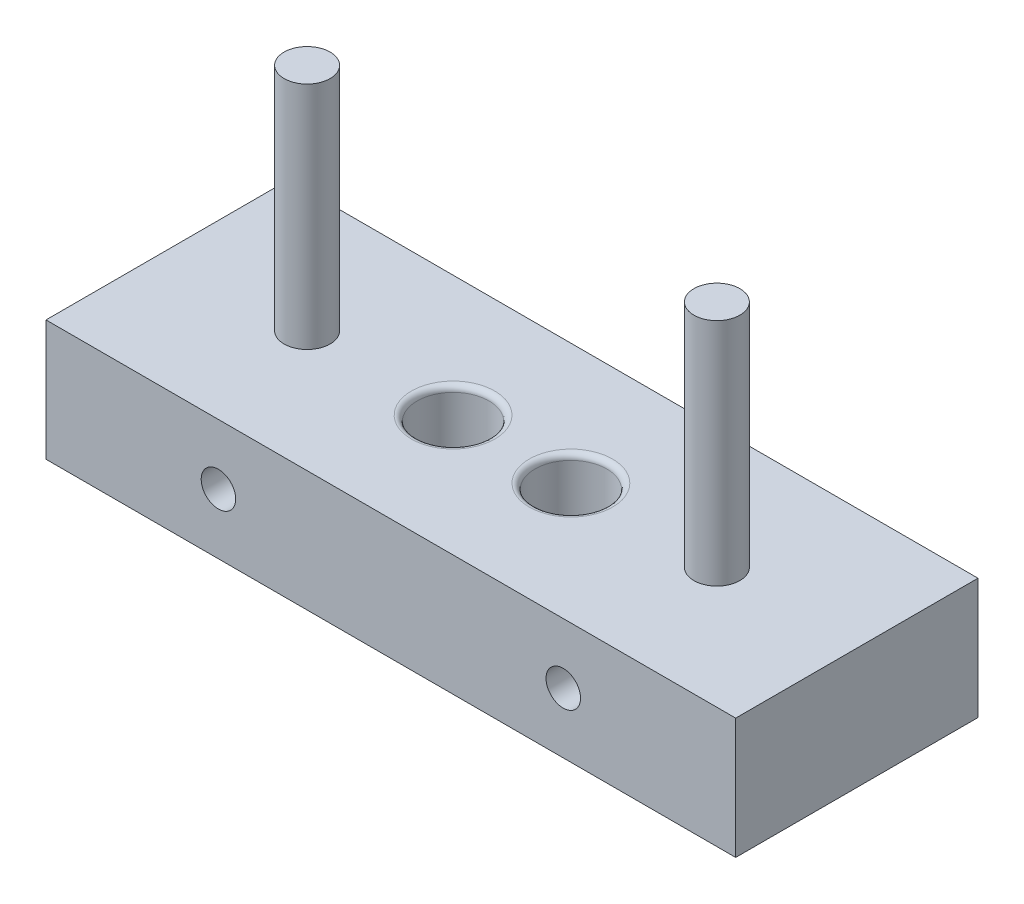
ISO-10303-21;
HEADER;
FILE_DESCRIPTION(('STEP AP214'),'2;1');
FILE_NAME('part.step','',(''),(''),'','','');
FILE_SCHEMA(('AUTOMOTIVE_DESIGN { 1 0 10303 214 1 1 1 1 }'));
ENDSEC;
DATA;
#1=APPLICATION_CONTEXT('core data for automotive mechanical design processes');
#2=APPLICATION_PROTOCOL_DEFINITION('international standard','automotive_design',2000,#1);
#3=PRODUCT_CONTEXT('',#1,'mechanical');
#4=PRODUCT('Part','Part','',(#3));
#5=PRODUCT_RELATED_PRODUCT_CATEGORY('part','',(#4));
#6=PRODUCT_DEFINITION_FORMATION('','',#4);
#7=PRODUCT_DEFINITION_CONTEXT('part definition',#1,'design');
#8=PRODUCT_DEFINITION('design','',#6,#7);
#9=PRODUCT_DEFINITION_SHAPE('','',#8);
#10=(LENGTH_UNIT() NAMED_UNIT(*) SI_UNIT(.MILLI.,.METRE.));
#11=(NAMED_UNIT(*) PLANE_ANGLE_UNIT() SI_UNIT($,.RADIAN.));
#12=(NAMED_UNIT(*) SI_UNIT($,.STERADIAN.) SOLID_ANGLE_UNIT());
#13=UNCERTAINTY_MEASURE_WITH_UNIT(LENGTH_MEASURE(1.E-05),#10,'distance_accuracy_value','');
#14=(GEOMETRIC_REPRESENTATION_CONTEXT(3) GLOBAL_UNCERTAINTY_ASSIGNED_CONTEXT((#13)) GLOBAL_UNIT_ASSIGNED_CONTEXT((#10,
#11,#12)) REPRESENTATION_CONTEXT('',''));
#15=CARTESIAN_POINT('',(0.,0.,0.));
#16=DIRECTION('',(0.,0.,1.));
#17=DIRECTION('',(1.,0.,0.));
#18=AXIS2_PLACEMENT_3D('',#15,#16,#17);
#19=CARTESIAN_POINT('',(-43.188970763014,21.,-20.565514618493));
#20=DIRECTION('',(1.,0.,0.));
#21=DIRECTION('',(0.,0.,-1.));
#22=AXIS2_PLACEMENT_3D('',#19,#20,#21);
#23=PLANE('',#22);
#24=DIRECTION('',(0.,0.,1.));
#25=VECTOR('',#24,1.);
#26=CARTESIAN_POINT('',(-43.188970763014,0.,-20.565514618493));
#27=LINE('',#26,#25);
#28=CARTESIAN_POINT('',(-43.188970763014,0.,-20.565514618493));
#29=VERTEX_POINT('',#28);
#30=CARTESIAN_POINT('',(-43.188970763014,0.,21.594485381507));
#31=VERTEX_POINT('',#30);
#32=EDGE_CURVE('E104',#29,#31,#27,.T.);
#33=ORIENTED_EDGE('',*,*,#32,.T.);
#34=DIRECTION('',(0.,-1.,0.));
#35=VECTOR('',#34,1.);
#36=CARTESIAN_POINT('',(-43.188970763014,21.,21.594485381507));
#37=LINE('',#36,#35);
#38=CARTESIAN_POINT('',(-43.188970763014,21.,21.594485381507));
#39=VERTEX_POINT('',#38);
#40=EDGE_CURVE('E95',#39,#31,#37,.T.);
#41=ORIENTED_EDGE('',*,*,#40,.F.);
#42=DIRECTION('',(0.,0.,1.));
#43=VECTOR('',#42,1.);
#44=CARTESIAN_POINT('',(-43.188970763014,21.,-20.565514618493));
#45=LINE('',#44,#43);
#46=CARTESIAN_POINT('',(-43.188970763014,21.,-20.565514618493));
#47=VERTEX_POINT('',#46);
#48=EDGE_CURVE('E89',#47,#39,#45,.T.);
#49=ORIENTED_EDGE('',*,*,#48,.F.);
#50=DIRECTION('',(0.,-1.,0.));
#51=VECTOR('',#50,1.);
#52=CARTESIAN_POINT('',(-43.188970763014,21.,-20.565514618493));
#53=LINE('',#52,#51);
#54=EDGE_CURVE('E100',#47,#29,#53,.T.);
#55=ORIENTED_EDGE('',*,*,#54,.T.);
#56=EDGE_LOOP('',(#33,#41,#49,#55));
#57=FACE_BOUND('',#56,.T.);
#58=ADVANCED_FACE('F36',(#57),#23,.F.);
#59=CARTESIAN_POINT('',(-43.188970763014,21.,21.594485381507));
#60=DIRECTION('',(0.,0.,-1.));
#61=DIRECTION('',(-1.,0.,0.));
#62=AXIS2_PLACEMENT_3D('',#59,#60,#61);
#63=PLANE('',#62);
#64=CARTESIAN_POINT('',(-13.188970763014,10.5,21.594485381507));
#65=DIRECTION('',(0.,0.,-1.));
#66=DIRECTION('',(-1.,0.,0.));
#67=AXIS2_PLACEMENT_3D('',#64,#65,#66);
#68=CIRCLE('',#67,3.);
#69=CARTESIAN_POINT('',(-16.188970763014,10.5,21.594485381507));
#70=VERTEX_POINT('',#69);
#71=EDGE_CURVE('E215',#70,#70,#68,.T.);
#72=ORIENTED_EDGE('',*,*,#71,.T.);
#73=EDGE_LOOP('',(#72));
#74=FACE_BOUND('',#73,.T.);
#75=CARTESIAN_POINT('',(46.811029236986,10.5,21.594485381507));
#76=DIRECTION('',(0.,0.,-1.));
#77=DIRECTION('',(-1.,0.,0.));
#78=AXIS2_PLACEMENT_3D('',#75,#76,#77);
#79=CIRCLE('',#78,2.99999999999999);
#80=CARTESIAN_POINT('',(43.811029236986,10.5,21.594485381507));
#81=VERTEX_POINT('',#80);
#82=EDGE_CURVE('E221',#81,#81,#79,.T.);
#83=ORIENTED_EDGE('',*,*,#82,.T.);
#84=EDGE_LOOP('',(#83));
#85=FACE_BOUND('',#84,.T.);
#86=DIRECTION('',(1.,0.,0.));
#87=VECTOR('',#86,1.);
#88=CARTESIAN_POINT('',(-43.188970763014,0.,21.594485381507));
#89=LINE('',#88,#87);
#90=CARTESIAN_POINT('',(76.811029236986,0.,21.594485381507));
#91=VERTEX_POINT('',#90);
#92=EDGE_CURVE('E94',#31,#91,#89,.T.);
#93=ORIENTED_EDGE('',*,*,#92,.T.);
#94=DIRECTION('',(0.,-1.,0.));
#95=VECTOR('',#94,1.);
#96=CARTESIAN_POINT('',(76.811029236986,21.,21.594485381507));
#97=LINE('',#96,#95);
#98=CARTESIAN_POINT('',(76.811029236986,21.,21.594485381507));
#99=VERTEX_POINT('',#98);
#100=EDGE_CURVE('E92',#99,#91,#97,.T.);
#101=ORIENTED_EDGE('',*,*,#100,.F.);
#102=DIRECTION('',(1.,0.,0.));
#103=VECTOR('',#102,1.);
#104=CARTESIAN_POINT('',(-43.188970763014,21.,21.594485381507));
#105=LINE('',#104,#103);
#106=EDGE_CURVE('E84',#39,#99,#105,.T.);
#107=ORIENTED_EDGE('',*,*,#106,.F.);
#108=ORIENTED_EDGE('',*,*,#40,.T.);
#109=EDGE_LOOP('',(#93,#101,#107,#108));
#110=FACE_BOUND('',#109,.T.);
#111=ADVANCED_FACE('F93',(#74,#85,#110),#63,.F.);
#112=CARTESIAN_POINT('',(76.811029236986,21.,-20.565514618493));
#113=DIRECTION('',(-1.,0.,0.));
#114=DIRECTION('',(0.,0.,1.));
#115=AXIS2_PLACEMENT_3D('',#112,#113,#114);
#116=PLANE('',#115);
#117=DIRECTION('',(0.,0.,-1.));
#118=VECTOR('',#117,1.);
#119=CARTESIAN_POINT('',(76.811029236986,0.,-20.565514618493));
#120=LINE('',#119,#118);
#121=CARTESIAN_POINT('',(76.811029236986,0.,-20.565514618493));
#122=VERTEX_POINT('',#121);
#123=EDGE_CURVE('E70',#91,#122,#120,.T.);
#124=ORIENTED_EDGE('',*,*,#123,.T.);
#125=DIRECTION('',(0.,-1.,0.));
#126=VECTOR('',#125,1.);
#127=CARTESIAN_POINT('',(76.811029236986,21.,-20.565514618493));
#128=LINE('',#127,#126);
#129=CARTESIAN_POINT('',(76.811029236986,21.,-20.565514618493));
#130=VERTEX_POINT('',#129);
#131=EDGE_CURVE('E96',#130,#122,#128,.T.);
#132=ORIENTED_EDGE('',*,*,#131,.F.);
#133=DIRECTION('',(0.,0.,-1.));
#134=VECTOR('',#133,1.);
#135=CARTESIAN_POINT('',(76.811029236986,21.,-20.565514618493));
#136=LINE('',#135,#134);
#137=EDGE_CURVE('E87',#99,#130,#136,.T.);
#138=ORIENTED_EDGE('',*,*,#137,.F.);
#139=ORIENTED_EDGE('',*,*,#100,.T.);
#140=EDGE_LOOP('',(#124,#132,#138,#139));
#141=FACE_BOUND('',#140,.T.);
#142=ADVANCED_FACE('F98',(#141),#116,.F.);
#143=CARTESIAN_POINT('',(-43.188970763014,21.,-20.565514618493));
#144=DIRECTION('',(0.,0.,1.));
#145=DIRECTION('',(1.,0.,0.));
#146=AXIS2_PLACEMENT_3D('',#143,#144,#145);
#147=PLANE('',#146);
#148=CARTESIAN_POINT('',(-13.188970763014,10.5,-20.565514618493));
#149=DIRECTION('',(0.,0.,-1.));
#150=DIRECTION('',(-1.,0.,0.));
#151=AXIS2_PLACEMENT_3D('',#148,#149,#150);
#152=CIRCLE('',#151,3.);
#153=CARTESIAN_POINT('',(-16.188970763014,10.5,-20.565514618493));
#154=VERTEX_POINT('',#153);
#155=EDGE_CURVE('E224',#154,#154,#152,.T.);
#156=ORIENTED_EDGE('',*,*,#155,.F.);
#157=EDGE_LOOP('',(#156));
#158=FACE_BOUND('',#157,.T.);
#159=CARTESIAN_POINT('',(46.811029236986,10.5,-20.565514618493));
#160=DIRECTION('',(0.,0.,-1.));
#161=DIRECTION('',(-1.,0.,0.));
#162=AXIS2_PLACEMENT_3D('',#159,#160,#161);
#163=CIRCLE('',#162,2.99999999999999);
#164=CARTESIAN_POINT('',(43.811029236986,10.5,-20.565514618493));
#165=VERTEX_POINT('',#164);
#166=EDGE_CURVE('E218',#165,#165,#163,.T.);
#167=ORIENTED_EDGE('',*,*,#166,.F.);
#168=EDGE_LOOP('',(#167));
#169=FACE_BOUND('',#168,.T.);
#170=DIRECTION('',(-1.,0.,0.));
#171=VECTOR('',#170,1.);
#172=CARTESIAN_POINT('',(-43.188970763014,0.,-20.565514618493));
#173=LINE('',#172,#171);
#174=EDGE_CURVE('E76',#122,#29,#173,.T.);
#175=ORIENTED_EDGE('',*,*,#174,.T.);
#176=ORIENTED_EDGE('',*,*,#54,.F.);
#177=DIRECTION('',(-1.,0.,0.));
#178=VECTOR('',#177,1.);
#179=CARTESIAN_POINT('',(-43.188970763014,21.,-20.565514618493));
#180=LINE('',#179,#178);
#181=EDGE_CURVE('E53',#130,#47,#180,.T.);
#182=ORIENTED_EDGE('',*,*,#181,.F.);
#183=ORIENTED_EDGE('',*,*,#131,.T.);
#184=EDGE_LOOP('',(#175,#176,#182,#183));
#185=FACE_BOUND('',#184,.T.);
#186=ADVANCED_FACE('F152',(#158,#169,#185),#147,.F.);
#187=CARTESIAN_POINT('',(0.,21.,0.));
#188=DIRECTION('',(0.,1.,0.));
#189=DIRECTION('',(0.,0.,1.));
#190=AXIS2_PLACEMENT_3D('',#187,#188,#189);
#191=PLANE('',#190);
#192=CARTESIAN_POINT('',(-18.838970763014,21.,0.514485381507019));
#193=DIRECTION('',(0.,1.,0.));
#194=DIRECTION('',(0.,0.,1.));
#195=AXIS2_PLACEMENT_3D('',#192,#193,#194);
#196=CIRCLE('',#195,4.);
#197=CARTESIAN_POINT('',(-18.838970763014,21.,4.51448538150702));
#198=VERTEX_POINT('',#197);
#199=EDGE_CURVE('E212',#198,#198,#196,.T.);
#200=ORIENTED_EDGE('',*,*,#199,.F.);
#201=EDGE_LOOP('',(#200));
#202=FACE_BOUND('',#201,.T.);
#203=CARTESIAN_POINT('',(52.461029236986,21.,0.514485381507019));
#204=DIRECTION('',(0.,1.,0.));
#205=DIRECTION('',(0.,0.,1.));
#206=AXIS2_PLACEMENT_3D('',#203,#204,#205);
#207=CIRCLE('',#206,4.00000000000001);
#208=CARTESIAN_POINT('',(52.461029236986,21.,4.51448538150702));
#209=VERTEX_POINT('',#208);
#210=EDGE_CURVE('E206',#209,#209,#207,.T.);
#211=ORIENTED_EDGE('',*,*,#210,.F.);
#212=EDGE_LOOP('',(#211));
#213=FACE_BOUND('',#212,.T.);
#214=CARTESIAN_POINT('',(6.56102923698599,21.,0.514485381507019));
#215=DIRECTION('',(0.,1.,0.));
#216=DIRECTION('',(0.,0.,1.));
#217=AXIS2_PLACEMENT_3D('',#214,#215,#216);
#218=CIRCLE('',#217,7.25);
#219=CARTESIAN_POINT('',(6.56102923698599,21.,7.76448538150702));
#220=VERTEX_POINT('',#219);
#221=EDGE_CURVE('E120',#220,#220,#218,.F.);
#222=ORIENTED_EDGE('',*,*,#221,.T.);
#223=EDGE_LOOP('',(#222));
#224=FACE_BOUND('',#223,.T.);
#225=CARTESIAN_POINT('',(27.061029236986,21.,0.514485381507019));
#226=DIRECTION('',(0.,1.,0.));
#227=DIRECTION('',(0.,0.,1.));
#228=AXIS2_PLACEMENT_3D('',#225,#226,#227);
#229=CIRCLE('',#228,7.25);
#230=CARTESIAN_POINT('',(27.061029236986,21.,7.76448538150702));
#231=VERTEX_POINT('',#230);
#232=EDGE_CURVE('E117',#231,#231,#229,.F.);
#233=ORIENTED_EDGE('',*,*,#232,.T.);
#234=EDGE_LOOP('',(#233));
#235=FACE_BOUND('',#234,.T.);
#236=ORIENTED_EDGE('',*,*,#48,.T.);
#237=ORIENTED_EDGE('',*,*,#106,.T.);
#238=ORIENTED_EDGE('',*,*,#137,.T.);
#239=ORIENTED_EDGE('',*,*,#181,.T.);
#240=EDGE_LOOP('',(#236,#237,#238,#239));
#241=FACE_BOUND('',#240,.T.);
#242=ADVANCED_FACE('F85',(#202,#213,#224,#235,#241),#191,.T.);
#243=CARTESIAN_POINT('',(0.,0.,0.));
#244=DIRECTION('',(0.,1.,0.));
#245=DIRECTION('',(0.,0.,1.));
#246=AXIS2_PLACEMENT_3D('',#243,#244,#245);
#247=PLANE('',#246);
#248=CARTESIAN_POINT('',(6.56102923698599,0.,0.514485381507019));
#249=DIRECTION('',(0.,1.,0.));
#250=DIRECTION('',(0.,0.,1.));
#251=AXIS2_PLACEMENT_3D('',#248,#249,#250);
#252=CIRCLE('',#251,3.75);
#253=CARTESIAN_POINT('',(6.56102923698599,0.,4.26448538150702));
#254=VERTEX_POINT('',#253);
#255=EDGE_CURVE('E129',#254,#254,#252,.T.);
#256=ORIENTED_EDGE('',*,*,#255,.T.);
#257=EDGE_LOOP('',(#256));
#258=FACE_BOUND('',#257,.T.);
#259=CARTESIAN_POINT('',(27.061029236986,0.,0.514485381507019));
#260=DIRECTION('',(0.,1.,0.));
#261=DIRECTION('',(0.,0.,1.));
#262=AXIS2_PLACEMENT_3D('',#259,#260,#261);
#263=CIRCLE('',#262,3.75);
#264=CARTESIAN_POINT('',(27.061029236986,0.,4.26448538150702));
#265=VERTEX_POINT('',#264);
#266=EDGE_CURVE('E126',#265,#265,#263,.T.);
#267=ORIENTED_EDGE('',*,*,#266,.T.);
#268=EDGE_LOOP('',(#267));
#269=FACE_BOUND('',#268,.T.);
#270=ORIENTED_EDGE('',*,*,#32,.F.);
#271=ORIENTED_EDGE('',*,*,#174,.F.);
#272=ORIENTED_EDGE('',*,*,#123,.F.);
#273=ORIENTED_EDGE('',*,*,#92,.F.);
#274=EDGE_LOOP('',(#270,#271,#272,#273));
#275=FACE_BOUND('',#274,.T.);
#276=ADVANCED_FACE('F143',(#258,#269,#275),#247,.F.);
#277=CARTESIAN_POINT('',(27.061029236986,7.,0.514485381507019));
#278=DIRECTION('',(0.,1.,0.));
#279=DIRECTION('',(0.,0.,1.));
#280=AXIS2_PLACEMENT_3D('',#277,#278,#279);
#281=CYLINDRICAL_SURFACE('',#280,6.25);
#282=CARTESIAN_POINT('',(27.061029236986,20.,0.514485381507019));
#283=DIRECTION('',(0.,1.,0.));
#284=DIRECTION('',(0.,0.,1.));
#285=AXIS2_PLACEMENT_3D('',#282,#283,#284);
#286=CIRCLE('',#285,6.25);
#287=CARTESIAN_POINT('',(27.061029236986,20.,6.76448538150702));
#288=VERTEX_POINT('',#287);
#289=EDGE_CURVE('E123',#288,#288,#286,.T.);
#290=ORIENTED_EDGE('',*,*,#289,.T.);
#291=EDGE_LOOP('',(#290));
#292=FACE_BOUND('',#291,.T.);
#293=CARTESIAN_POINT('',(27.061029236986,7.,0.514485381507019));
#294=DIRECTION('',(0.,1.,0.));
#295=DIRECTION('',(0.,0.,1.));
#296=AXIS2_PLACEMENT_3D('',#293,#294,#295);
#297=CIRCLE('',#296,6.25);
#298=CARTESIAN_POINT('',(27.061029236986,7.,6.76448538150702));
#299=VERTEX_POINT('',#298);
#300=EDGE_CURVE('E107',#299,#299,#297,.T.);
#301=ORIENTED_EDGE('',*,*,#300,.F.);
#302=EDGE_LOOP('',(#301));
#303=FACE_BOUND('',#302,.T.);
#304=ADVANCED_FACE('F146',(#292,#303),#281,.F.);
#305=CARTESIAN_POINT('',(0.,7.,0.));
#306=DIRECTION('',(0.,1.,0.));
#307=DIRECTION('',(0.,0.,1.));
#308=AXIS2_PLACEMENT_3D('',#305,#306,#307);
#309=PLANE('',#308);
#310=CARTESIAN_POINT('',(27.061029236986,7.,0.514485381507019));
#311=DIRECTION('',(0.,1.,0.));
#312=DIRECTION('',(0.,0.,1.));
#313=AXIS2_PLACEMENT_3D('',#310,#311,#312);
#314=CIRCLE('',#313,3.25);
#315=CARTESIAN_POINT('',(27.061029236986,7.,3.76448538150702));
#316=VERTEX_POINT('',#315);
#317=EDGE_CURVE('E197',#316,#316,#314,.T.);
#318=ORIENTED_EDGE('',*,*,#317,.F.);
#319=EDGE_LOOP('',(#318));
#320=FACE_BOUND('',#319,.T.);
#321=ORIENTED_EDGE('',*,*,#300,.T.);
#322=EDGE_LOOP('',(#321));
#323=FACE_BOUND('',#322,.T.);
#324=ADVANCED_FACE('F189',(#320,#323),#309,.T.);
#325=CARTESIAN_POINT('',(6.56102923698599,7.,0.514485381507019));
#326=DIRECTION('',(0.,1.,0.));
#327=DIRECTION('',(0.,0.,1.));
#328=AXIS2_PLACEMENT_3D('',#325,#326,#327);
#329=CYLINDRICAL_SURFACE('',#328,6.25);
#330=CARTESIAN_POINT('',(6.56102923698599,20.,0.514485381507019));
#331=DIRECTION('',(0.,1.,0.));
#332=DIRECTION('',(0.,0.,1.));
#333=AXIS2_PLACEMENT_3D('',#330,#331,#332);
#334=CIRCLE('',#333,6.25);
#335=CARTESIAN_POINT('',(6.56102923698599,20.,6.76448538150702));
#336=VERTEX_POINT('',#335);
#337=EDGE_CURVE('E114',#336,#336,#334,.T.);
#338=ORIENTED_EDGE('',*,*,#337,.T.);
#339=EDGE_LOOP('',(#338));
#340=FACE_BOUND('',#339,.T.);
#341=CARTESIAN_POINT('',(6.56102923698599,7.,0.514485381507019));
#342=DIRECTION('',(0.,1.,0.));
#343=DIRECTION('',(0.,0.,1.));
#344=AXIS2_PLACEMENT_3D('',#341,#342,#343);
#345=CIRCLE('',#344,6.25);
#346=CARTESIAN_POINT('',(6.56102923698599,7.,6.76448538150702));
#347=VERTEX_POINT('',#346);
#348=EDGE_CURVE('E194',#347,#347,#345,.T.);
#349=ORIENTED_EDGE('',*,*,#348,.F.);
#350=EDGE_LOOP('',(#349));
#351=FACE_BOUND('',#350,.T.);
#352=ADVANCED_FACE('F267',(#340,#351),#329,.F.);
#353=CARTESIAN_POINT('',(0.,7.,0.));
#354=DIRECTION('',(0.,1.,0.));
#355=DIRECTION('',(0.,0.,1.));
#356=AXIS2_PLACEMENT_3D('',#353,#354,#355);
#357=PLANE('',#356);
#358=CARTESIAN_POINT('',(6.56102923698599,7.,0.514485381507019));
#359=DIRECTION('',(0.,1.,0.));
#360=DIRECTION('',(0.,0.,1.));
#361=AXIS2_PLACEMENT_3D('',#358,#359,#360);
#362=CIRCLE('',#361,3.25);
#363=CARTESIAN_POINT('',(6.56102923698599,7.,3.76448538150702));
#364=VERTEX_POINT('',#363);
#365=EDGE_CURVE('E202',#364,#364,#362,.T.);
#366=ORIENTED_EDGE('',*,*,#365,.F.);
#367=EDGE_LOOP('',(#366));
#368=FACE_BOUND('',#367,.T.);
#369=ORIENTED_EDGE('',*,*,#348,.T.);
#370=EDGE_LOOP('',(#369));
#371=FACE_BOUND('',#370,.T.);
#372=ADVANCED_FACE('F263',(#368,#371),#357,.T.);
#373=CARTESIAN_POINT('',(27.061029236986,0.,0.514485381507019));
#374=DIRECTION('',(0.,1.,0.));
#375=DIRECTION('',(0.,0.,1.));
#376=AXIS2_PLACEMENT_3D('',#373,#374,#375);
#377=CYLINDRICAL_SURFACE('',#376,3.25);
#378=CARTESIAN_POINT('',(27.061029236986,0.5,0.514485381507019));
#379=DIRECTION('',(0.,1.,0.));
#380=DIRECTION('',(0.,0.,1.));
#381=AXIS2_PLACEMENT_3D('',#378,#379,#380);
#382=CIRCLE('',#381,3.25);
#383=CARTESIAN_POINT('',(27.061029236986,0.5,3.76448538150702));
#384=VERTEX_POINT('',#383);
#385=EDGE_CURVE('E11',#384,#384,#382,.F.);
#386=ORIENTED_EDGE('',*,*,#385,.T.);
#387=EDGE_LOOP('',(#386));
#388=FACE_BOUND('',#387,.T.);
#389=ORIENTED_EDGE('',*,*,#317,.T.);
#390=EDGE_LOOP('',(#389));
#391=FACE_BOUND('',#390,.T.);
#392=ADVANCED_FACE('F260',(#388,#391),#377,.F.);
#393=CARTESIAN_POINT('',(6.56102923698599,0.,0.514485381507019));
#394=DIRECTION('',(0.,1.,0.));
#395=DIRECTION('',(0.,0.,1.));
#396=AXIS2_PLACEMENT_3D('',#393,#394,#395);
#397=CYLINDRICAL_SURFACE('',#396,3.25);
#398=CARTESIAN_POINT('',(6.56102923698599,0.5,0.514485381507019));
#399=DIRECTION('',(0.,1.,0.));
#400=DIRECTION('',(0.,0.,1.));
#401=AXIS2_PLACEMENT_3D('',#398,#399,#400);
#402=CIRCLE('',#401,3.25);
#403=CARTESIAN_POINT('',(6.56102923698599,0.5,3.76448538150702));
#404=VERTEX_POINT('',#403);
#405=EDGE_CURVE('E45',#404,#404,#402,.F.);
#406=ORIENTED_EDGE('',*,*,#405,.T.);
#407=EDGE_LOOP('',(#406));
#408=FACE_BOUND('',#407,.T.);
#409=ORIENTED_EDGE('',*,*,#365,.T.);
#410=EDGE_LOOP('',(#409));
#411=FACE_BOUND('',#410,.T.);
#412=ADVANCED_FACE('F134',(#408,#411),#397,.F.);
#413=CARTESIAN_POINT('',(6.56102923698599,20.,0.514485381507019));
#414=DIRECTION('',(0.,1.,0.));
#415=DIRECTION('',(0.,0.,1.));
#416=AXIS2_PLACEMENT_3D('',#413,#414,#415);
#417=TOROIDAL_SURFACE('',#416,7.25,1.);
#418=ORIENTED_EDGE('',*,*,#221,.F.);
#419=EDGE_LOOP('',(#418));
#420=FACE_BOUND('',#419,.T.);
#421=ORIENTED_EDGE('',*,*,#337,.F.);
#422=EDGE_LOOP('',(#421));
#423=FACE_BOUND('',#422,.T.);
#424=ADVANCED_FACE('F175',(#420,#423),#417,.T.);
#425=CARTESIAN_POINT('',(27.061029236986,20.,0.514485381507019));
#426=DIRECTION('',(0.,1.,0.));
#427=DIRECTION('',(0.,0.,1.));
#428=AXIS2_PLACEMENT_3D('',#425,#426,#427);
#429=TOROIDAL_SURFACE('',#428,7.25,1.);
#430=ORIENTED_EDGE('',*,*,#232,.F.);
#431=EDGE_LOOP('',(#430));
#432=FACE_BOUND('',#431,.T.);
#433=ORIENTED_EDGE('',*,*,#289,.F.);
#434=EDGE_LOOP('',(#433));
#435=FACE_BOUND('',#434,.T.);
#436=ADVANCED_FACE('F140',(#432,#435),#429,.T.);
#437=CARTESIAN_POINT('',(6.56102923698599,0.5,0.514485381507019));
#438=DIRECTION('',(0.,1.,0.));
#439=DIRECTION('',(0.,0.,1.));
#440=AXIS2_PLACEMENT_3D('',#437,#438,#439);
#441=TOROIDAL_SURFACE('',#440,3.75,0.5);
#442=ORIENTED_EDGE('',*,*,#405,.F.);
#443=EDGE_LOOP('',(#442));
#444=FACE_BOUND('',#443,.T.);
#445=ORIENTED_EDGE('',*,*,#255,.F.);
#446=EDGE_LOOP('',(#445));
#447=FACE_BOUND('',#446,.T.);
#448=ADVANCED_FACE('F137',(#444,#447),#441,.T.);
#449=CARTESIAN_POINT('',(27.061029236986,0.5,0.514485381507019));
#450=DIRECTION('',(0.,1.,0.));
#451=DIRECTION('',(0.,0.,1.));
#452=AXIS2_PLACEMENT_3D('',#449,#450,#451);
#453=TOROIDAL_SURFACE('',#452,3.75,0.5);
#454=ORIENTED_EDGE('',*,*,#385,.F.);
#455=EDGE_LOOP('',(#454));
#456=FACE_BOUND('',#455,.T.);
#457=ORIENTED_EDGE('',*,*,#266,.F.);
#458=EDGE_LOOP('',(#457));
#459=FACE_BOUND('',#458,.T.);
#460=ADVANCED_FACE('F38',(#456,#459),#453,.T.);
#461=CARTESIAN_POINT('',(52.461029236986,61.,0.514485381507019));
#462=DIRECTION('',(0.,-1.,0.));
#463=DIRECTION('',(0.,0.,-1.));
#464=AXIS2_PLACEMENT_3D('',#461,#462,#463);
#465=CYLINDRICAL_SURFACE('',#464,4.00000000000001);
#466=CARTESIAN_POINT('',(52.461029236986,61.,0.514485381507019));
#467=DIRECTION('',(0.,1.,0.));
#468=DIRECTION('',(0.,0.,1.));
#469=AXIS2_PLACEMENT_3D('',#466,#467,#468);
#470=CIRCLE('',#469,4.00000000000001);
#471=CARTESIAN_POINT('',(52.461029236986,61.,4.51448538150702));
#472=VERTEX_POINT('',#471);
#473=EDGE_CURVE('E205',#472,#472,#470,.T.);
#474=ORIENTED_EDGE('',*,*,#473,.F.);
#475=EDGE_LOOP('',(#474));
#476=FACE_BOUND('',#475,.T.);
#477=ORIENTED_EDGE('',*,*,#210,.T.);
#478=EDGE_LOOP('',(#477));
#479=FACE_BOUND('',#478,.T.);
#480=ADVANCED_FACE('F253',(#476,#479),#465,.T.);
#481=CARTESIAN_POINT('',(0.,61.,0.));
#482=DIRECTION('',(0.,1.,0.));
#483=DIRECTION('',(0.,0.,1.));
#484=AXIS2_PLACEMENT_3D('',#481,#482,#483);
#485=PLANE('',#484);
#486=ORIENTED_EDGE('',*,*,#473,.T.);
#487=EDGE_LOOP('',(#486));
#488=FACE_BOUND('',#487,.T.);
#489=ADVANCED_FACE('F249',(#488),#485,.T.);
#490=CARTESIAN_POINT('',(-18.838970763014,61.,0.514485381507019));
#491=DIRECTION('',(0.,-1.,0.));
#492=DIRECTION('',(0.,0.,-1.));
#493=AXIS2_PLACEMENT_3D('',#490,#491,#492);
#494=CYLINDRICAL_SURFACE('',#493,4.);
#495=CARTESIAN_POINT('',(-18.838970763014,61.,0.514485381507019));
#496=DIRECTION('',(0.,1.,0.));
#497=DIRECTION('',(0.,0.,1.));
#498=AXIS2_PLACEMENT_3D('',#495,#496,#497);
#499=CIRCLE('',#498,4.);
#500=CARTESIAN_POINT('',(-18.838970763014,61.,4.51448538150702));
#501=VERTEX_POINT('',#500);
#502=EDGE_CURVE('E209',#501,#501,#499,.T.);
#503=ORIENTED_EDGE('',*,*,#502,.F.);
#504=EDGE_LOOP('',(#503));
#505=FACE_BOUND('',#504,.T.);
#506=ORIENTED_EDGE('',*,*,#199,.T.);
#507=EDGE_LOOP('',(#506));
#508=FACE_BOUND('',#507,.T.);
#509=ADVANCED_FACE('F245',(#505,#508),#494,.T.);
#510=CARTESIAN_POINT('',(0.,61.,0.));
#511=DIRECTION('',(0.,1.,0.));
#512=DIRECTION('',(0.,0.,1.));
#513=AXIS2_PLACEMENT_3D('',#510,#511,#512);
#514=PLANE('',#513);
#515=ORIENTED_EDGE('',*,*,#502,.T.);
#516=EDGE_LOOP('',(#515));
#517=FACE_BOUND('',#516,.T.);
#518=ADVANCED_FACE('F239',(#517),#514,.T.);
#519=CARTESIAN_POINT('',(46.811029236986,10.5,21.594485381507));
#520=DIRECTION('',(0.,0.,-1.));
#521=DIRECTION('',(-1.,0.,0.));
#522=AXIS2_PLACEMENT_3D('',#519,#520,#521);
#523=CYLINDRICAL_SURFACE('',#522,2.99999999999999);
#524=ORIENTED_EDGE('',*,*,#82,.F.);
#525=EDGE_LOOP('',(#524));
#526=FACE_BOUND('',#525,.T.);
#527=ORIENTED_EDGE('',*,*,#166,.T.);
#528=EDGE_LOOP('',(#527));
#529=FACE_BOUND('',#528,.T.);
#530=ADVANCED_FACE('F234',(#526,#529),#523,.F.);
#531=CARTESIAN_POINT('',(-13.188970763014,10.5,21.594485381507));
#532=DIRECTION('',(0.,0.,-1.));
#533=DIRECTION('',(-1.,0.,0.));
#534=AXIS2_PLACEMENT_3D('',#531,#532,#533);
#535=CYLINDRICAL_SURFACE('',#534,3.);
#536=ORIENTED_EDGE('',*,*,#71,.F.);
#537=EDGE_LOOP('',(#536));
#538=FACE_BOUND('',#537,.T.);
#539=ORIENTED_EDGE('',*,*,#155,.T.);
#540=EDGE_LOOP('',(#539));
#541=FACE_BOUND('',#540,.T.);
#542=ADVANCED_FACE('F231',(#538,#541),#535,.F.);
#543=CLOSED_SHELL('',(#58,#111,#142,#186,#242,#276,#304,#324,#352,#372,#392,#412,#424,#436,#448,
#460,#480,#489,#509,#518,#530,#542));
#544=MANIFOLD_SOLID_BREP('B2',#543);
#545=ADVANCED_BREP_SHAPE_REPRESENTATION('',(#18,#544),#14);
#546=SHAPE_DEFINITION_REPRESENTATION(#9,#545);
ENDSEC;
END-ISO-10303-21;
